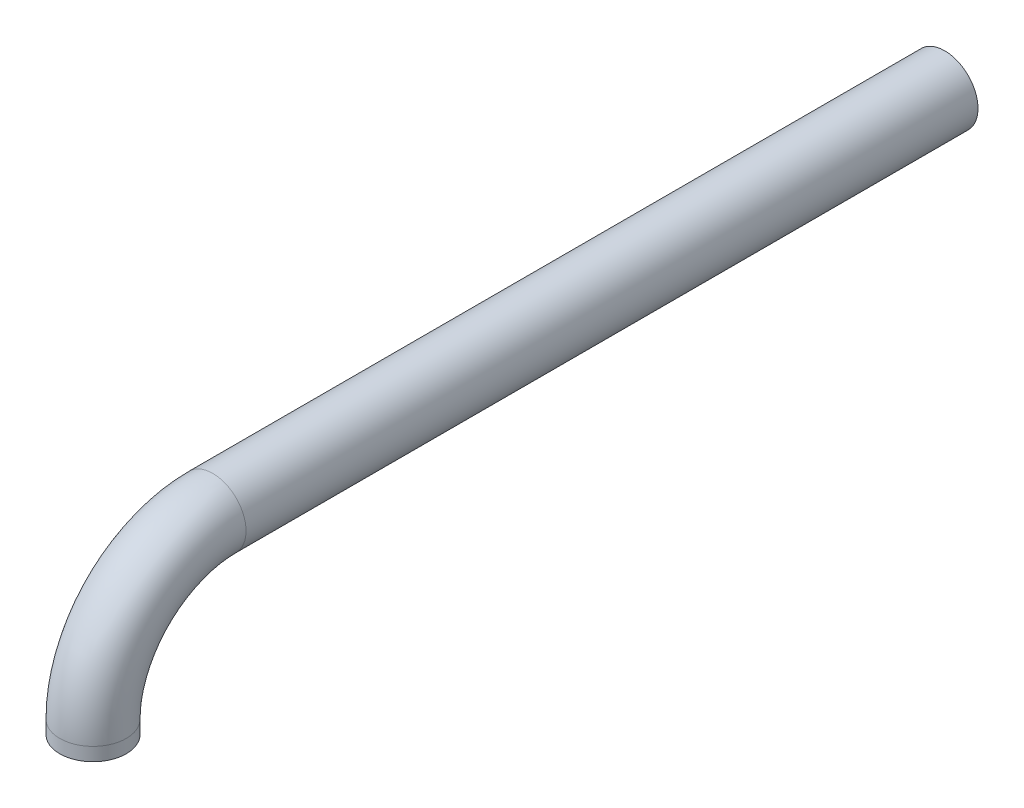
ISO-10303-21;
HEADER;
FILE_DESCRIPTION(('STEP AP214'),'2;1');
FILE_NAME('part.step','',(''),(''),'','','');
FILE_SCHEMA(('AUTOMOTIVE_DESIGN { 1 0 10303 214 1 1 1 1 }'));
ENDSEC;
DATA;
#1=APPLICATION_CONTEXT('core data for automotive mechanical design processes');
#2=APPLICATION_PROTOCOL_DEFINITION('international standard','automotive_design',2000,#1);
#3=PRODUCT_CONTEXT('',#1,'mechanical');
#4=PRODUCT('Part','Part','',(#3));
#5=PRODUCT_RELATED_PRODUCT_CATEGORY('part','',(#4));
#6=PRODUCT_DEFINITION_FORMATION('','',#4);
#7=PRODUCT_DEFINITION_CONTEXT('part definition',#1,'design');
#8=PRODUCT_DEFINITION('design','',#6,#7);
#9=PRODUCT_DEFINITION_SHAPE('','',#8);
#10=(LENGTH_UNIT() NAMED_UNIT(*) SI_UNIT(.MILLI.,.METRE.));
#11=(NAMED_UNIT(*) PLANE_ANGLE_UNIT() SI_UNIT($,.RADIAN.));
#12=(NAMED_UNIT(*) SI_UNIT($,.STERADIAN.) SOLID_ANGLE_UNIT());
#13=UNCERTAINTY_MEASURE_WITH_UNIT(LENGTH_MEASURE(1.E-05),#10,'distance_accuracy_value','');
#14=(GEOMETRIC_REPRESENTATION_CONTEXT(3) GLOBAL_UNCERTAINTY_ASSIGNED_CONTEXT((#13)) GLOBAL_UNIT_ASSIGNED_CONTEXT((#10,
#11,#12)) REPRESENTATION_CONTEXT('',''));
#15=CARTESIAN_POINT('',(0.,0.,0.));
#16=DIRECTION('',(0.,0.,1.));
#17=DIRECTION('',(1.,0.,0.));
#18=AXIS2_PLACEMENT_3D('',#15,#16,#17);
#19=CARTESIAN_POINT('',(0.,5.,-4.50000000000003));
#20=DIRECTION('',(0.,0.,-1.));
#21=DIRECTION('',(-1.,0.,0.));
#22=AXIS2_PLACEMENT_3D('',#19,#20,#21);
#23=CYLINDRICAL_SURFACE('',#22,1.25);
#24=CARTESIAN_POINT('',(0.,5.,-4.50000000000003));
#25=DIRECTION('',(0.,0.,-1.));
#26=DIRECTION('',(0.,1.,0.));
#27=AXIS2_PLACEMENT_3D('',#24,#25,#26);
#28=CIRCLE('',#27,1.25);
#29=CARTESIAN_POINT('',(0.,6.25,-4.50000000000004));
#30=VERTEX_POINT('',#29);
#31=EDGE_CURVE('E41',#30,#30,#28,.T.);
#32=ORIENTED_EDGE('',*,*,#31,.T.);
#33=EDGE_LOOP('',(#32));
#34=FACE_BOUND('',#33,.T.);
#35=CARTESIAN_POINT('',(0.,5.,-32.));
#36=DIRECTION('',(0.,0.,-1.));
#37=DIRECTION('',(0.,1.,0.));
#38=AXIS2_PLACEMENT_3D('',#35,#36,#37);
#39=CIRCLE('',#38,1.25);
#40=CARTESIAN_POINT('',(0.,6.25,-32.));
#41=VERTEX_POINT('',#40);
#42=EDGE_CURVE('E10',#41,#41,#39,.T.);
#43=ORIENTED_EDGE('',*,*,#42,.F.);
#44=EDGE_LOOP('',(#43));
#45=FACE_BOUND('',#44,.T.);
#46=ADVANCED_FACE('F31',(#34,#45),#23,.T.);
#47=CARTESIAN_POINT('',(0.,5.,-4.50000000000003));
#48=DIRECTION('',(0.,0.,-1.));
#49=DIRECTION('',(-1.,0.,0.));
#50=AXIS2_PLACEMENT_3D('',#47,#48,#49);
#51=CYLINDRICAL_SURFACE('',#50,1.);
#52=CARTESIAN_POINT('',(0.,5.,-4.50000000000003));
#53=DIRECTION('',(0.,0.,-1.));
#54=DIRECTION('',(0.,1.,0.));
#55=AXIS2_PLACEMENT_3D('',#52,#53,#54);
#56=CIRCLE('',#55,1.);
#57=CARTESIAN_POINT('',(0.,6.,-4.50000000000004));
#58=VERTEX_POINT('',#57);
#59=EDGE_CURVE('E45',#58,#58,#56,.T.);
#60=ORIENTED_EDGE('',*,*,#59,.F.);
#61=EDGE_LOOP('',(#60));
#62=FACE_BOUND('',#61,.T.);
#63=CARTESIAN_POINT('',(0.,5.,-32.));
#64=DIRECTION('',(0.,0.,-1.));
#65=DIRECTION('',(0.,1.,0.));
#66=AXIS2_PLACEMENT_3D('',#63,#64,#65);
#67=CIRCLE('',#66,1.);
#68=CARTESIAN_POINT('',(0.,6.,-32.));
#69=VERTEX_POINT('',#68);
#70=EDGE_CURVE('E37',#69,#69,#67,.T.);
#71=ORIENTED_EDGE('',*,*,#70,.T.);
#72=EDGE_LOOP('',(#71));
#73=FACE_BOUND('',#72,.T.);
#74=ADVANCED_FACE('F73',(#62,#73),#51,.F.);
#75=CARTESIAN_POINT('',(0.,0.5,-4.5));
#76=DIRECTION('',(-1.,0.,0.));
#77=DIRECTION('',(0.,0.,1.));
#78=AXIS2_PLACEMENT_3D('',#75,#76,#77);
#79=TOROIDAL_SURFACE('',#78,4.5,1.25);
#80=CARTESIAN_POINT('',(0.,0.499999999999968,0.));
#81=DIRECTION('',(0.,1.,0.));
#82=DIRECTION('',(0.,0.,1.));
#83=AXIS2_PLACEMENT_3D('',#80,#81,#82);
#84=CIRCLE('',#83,1.25);
#85=CARTESIAN_POINT('',(0.,0.499999999999959,1.25));
#86=VERTEX_POINT('',#85);
#87=EDGE_CURVE('E50',#86,#86,#84,.T.);
#88=CARTESIAN_POINT('',(0.,0.5,-4.5));
#89=DIRECTION('',(-1.,0.,0.));
#90=DIRECTION('',(0.,0.,1.));
#91=AXIS2_PLACEMENT_3D('',#88,#89,#90);
#92=CIRCLE('',#91,5.75);
#93=EDGE_CURVE('',#86,#30,#92,.T.);
#94=ORIENTED_EDGE('',*,*,#87,.T.);
#95=ORIENTED_EDGE('',*,*,#31,.F.);
#96=ORIENTED_EDGE('',*,*,#93,.T.);
#97=ORIENTED_EDGE('',*,*,#93,.F.);
#98=EDGE_LOOP('',(#94,#96,#95,#97));
#99=FACE_BOUND('',#98,.T.);
#100=ADVANCED_FACE('F69',(#99),#79,.T.);
#101=CARTESIAN_POINT('',(0.,0.5,-4.5));
#102=DIRECTION('',(-1.,0.,0.));
#103=DIRECTION('',(0.,0.,1.));
#104=AXIS2_PLACEMENT_3D('',#101,#102,#103);
#105=TOROIDAL_SURFACE('',#104,4.5,1.);
#106=CARTESIAN_POINT('',(0.,0.499999999999968,0.));
#107=DIRECTION('',(0.,1.,0.));
#108=DIRECTION('',(0.,0.,1.));
#109=AXIS2_PLACEMENT_3D('',#106,#107,#108);
#110=CIRCLE('',#109,1.);
#111=CARTESIAN_POINT('',(0.,0.499999999999961,1.));
#112=VERTEX_POINT('',#111);
#113=EDGE_CURVE('E54',#112,#112,#110,.T.);
#114=CARTESIAN_POINT('',(0.,0.5,-4.5));
#115=DIRECTION('',(-1.,0.,0.));
#116=DIRECTION('',(0.,0.,1.));
#117=AXIS2_PLACEMENT_3D('',#114,#115,#116);
#118=CIRCLE('',#117,5.5);
#119=EDGE_CURVE('',#112,#58,#118,.T.);
#120=ORIENTED_EDGE('',*,*,#113,.F.);
#121=ORIENTED_EDGE('',*,*,#59,.T.);
#122=ORIENTED_EDGE('',*,*,#119,.T.);
#123=ORIENTED_EDGE('',*,*,#119,.F.);
#124=EDGE_LOOP('',(#120,#122,#121,#123));
#125=FACE_BOUND('',#124,.T.);
#126=ADVANCED_FACE('F66',(#125),#105,.F.);
#127=CARTESIAN_POINT('',(0.,0.499999999999968,0.));
#128=DIRECTION('',(0.,-1.,0.));
#129=DIRECTION('',(0.,0.,-1.));
#130=AXIS2_PLACEMENT_3D('',#127,#128,#129);
#131=CYLINDRICAL_SURFACE('',#130,1.);
#132=ORIENTED_EDGE('',*,*,#113,.T.);
#133=EDGE_LOOP('',(#132));
#134=FACE_BOUND('',#133,.T.);
#135=CARTESIAN_POINT('',(0.,0.,0.));
#136=DIRECTION('',(0.,1.,0.));
#137=DIRECTION('',(0.,0.,1.));
#138=AXIS2_PLACEMENT_3D('',#135,#136,#137);
#139=CIRCLE('',#138,1.);
#140=CARTESIAN_POINT('',(0.,0.,1.));
#141=VERTEX_POINT('',#140);
#142=EDGE_CURVE('E55',#141,#141,#139,.T.);
#143=ORIENTED_EDGE('',*,*,#142,.F.);
#144=EDGE_LOOP('',(#143));
#145=FACE_BOUND('',#144,.T.);
#146=ADVANCED_FACE('F63',(#134,#145),#131,.F.);
#147=CARTESIAN_POINT('',(0.,0.499999999999968,0.));
#148=DIRECTION('',(0.,-1.,0.));
#149=DIRECTION('',(0.,0.,-1.));
#150=AXIS2_PLACEMENT_3D('',#147,#148,#149);
#151=CYLINDRICAL_SURFACE('',#150,1.25);
#152=ORIENTED_EDGE('',*,*,#87,.F.);
#153=EDGE_LOOP('',(#152));
#154=FACE_BOUND('',#153,.T.);
#155=CARTESIAN_POINT('',(0.,0.,0.));
#156=DIRECTION('',(0.,1.,0.));
#157=DIRECTION('',(0.,0.,1.));
#158=AXIS2_PLACEMENT_3D('',#155,#156,#157);
#159=CIRCLE('',#158,1.25);
#160=CARTESIAN_POINT('',(0.,0.,1.25));
#161=VERTEX_POINT('',#160);
#162=EDGE_CURVE('E51',#161,#161,#159,.T.);
#163=ORIENTED_EDGE('',*,*,#162,.T.);
#164=EDGE_LOOP('',(#163));
#165=FACE_BOUND('',#164,.T.);
#166=ADVANCED_FACE('F85',(#154,#165),#151,.T.);
#167=CARTESIAN_POINT('',(0.,5.,-32.));
#168=DIRECTION('',(0.,0.,-1.));
#169=DIRECTION('',(0.,1.,0.));
#170=AXIS2_PLACEMENT_3D('',#167,#168,#169);
#171=PLANE('',#170);
#172=ORIENTED_EDGE('',*,*,#70,.F.);
#173=EDGE_LOOP('',(#172));
#174=FACE_BOUND('',#173,.T.);
#175=ORIENTED_EDGE('',*,*,#42,.T.);
#176=EDGE_LOOP('',(#175));
#177=FACE_BOUND('',#176,.T.);
#178=ADVANCED_FACE('F88',(#174,#177),#171,.T.);
#179=CARTESIAN_POINT('',(0.,0.,0.));
#180=DIRECTION('',(0.,1.,0.));
#181=DIRECTION('',(0.,0.,1.));
#182=AXIS2_PLACEMENT_3D('',#179,#180,#181);
#183=PLANE('',#182);
#184=ORIENTED_EDGE('',*,*,#142,.T.);
#185=EDGE_LOOP('',(#184));
#186=FACE_BOUND('',#185,.T.);
#187=ORIENTED_EDGE('',*,*,#162,.F.);
#188=EDGE_LOOP('',(#187));
#189=FACE_BOUND('',#188,.T.);
#190=ADVANCED_FACE('F90',(#186,#189),#183,.F.);
#191=CLOSED_SHELL('',(#46,#74,#100,#126,#146,#166,#178,#190));
#192=MANIFOLD_SOLID_BREP('B2',#191);
#193=ADVANCED_BREP_SHAPE_REPRESENTATION('',(#18,#192),#14);
#194=SHAPE_DEFINITION_REPRESENTATION(#9,#193);
ENDSEC;
END-ISO-10303-21;
